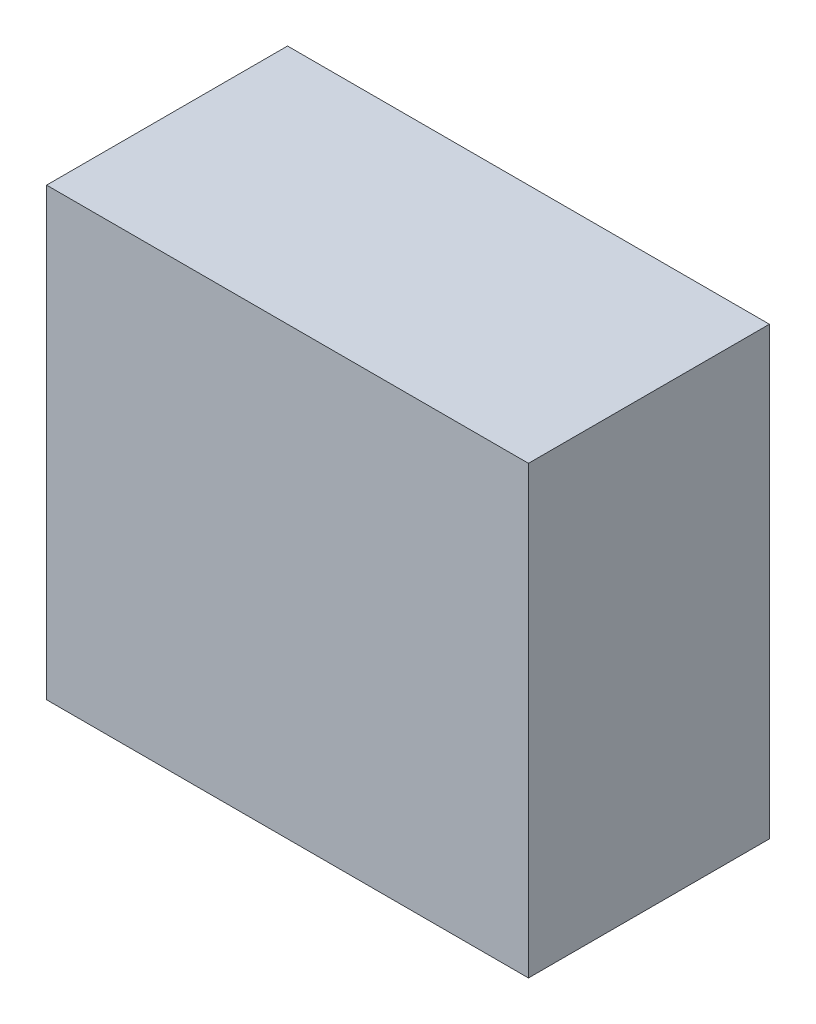
ISO-10303-21;
HEADER;
FILE_DESCRIPTION(('STEP AP214'),'2;1');
FILE_NAME('part.step','',(''),(''),'','','');
FILE_SCHEMA(('AUTOMOTIVE_DESIGN { 1 0 10303 214 1 1 1 1 }'));
ENDSEC;
DATA;
#1=APPLICATION_CONTEXT('core data for automotive mechanical design processes');
#2=APPLICATION_PROTOCOL_DEFINITION('international standard','automotive_design',2000,#1);
#3=PRODUCT_CONTEXT('',#1,'mechanical');
#4=PRODUCT('Part','Part','',(#3));
#5=PRODUCT_RELATED_PRODUCT_CATEGORY('part','',(#4));
#6=PRODUCT_DEFINITION_FORMATION('','',#4);
#7=PRODUCT_DEFINITION_CONTEXT('part definition',#1,'design');
#8=PRODUCT_DEFINITION('design','',#6,#7);
#9=PRODUCT_DEFINITION_SHAPE('','',#8);
#10=(LENGTH_UNIT() NAMED_UNIT(*) SI_UNIT(.MILLI.,.METRE.));
#11=(NAMED_UNIT(*) PLANE_ANGLE_UNIT() SI_UNIT($,.RADIAN.));
#12=(NAMED_UNIT(*) SI_UNIT($,.STERADIAN.) SOLID_ANGLE_UNIT());
#13=UNCERTAINTY_MEASURE_WITH_UNIT(LENGTH_MEASURE(1.E-05),#10,'distance_accuracy_value','');
#14=(GEOMETRIC_REPRESENTATION_CONTEXT(3) GLOBAL_UNCERTAINTY_ASSIGNED_CONTEXT((#13)) GLOBAL_UNIT_ASSIGNED_CONTEXT((#10,
#11,#12)) REPRESENTATION_CONTEXT('',''));
#15=CARTESIAN_POINT('',(0.,0.,0.));
#16=DIRECTION('',(0.,0.,1.));
#17=DIRECTION('',(1.,0.,0.));
#18=AXIS2_PLACEMENT_3D('',#15,#16,#17);
#19=CARTESIAN_POINT('',(0.,0.,10.));
#20=DIRECTION('',(1.,0.,0.));
#21=DIRECTION('',(0.,0.,-1.));
#22=AXIS2_PLACEMENT_3D('',#19,#20,#21);
#23=PLANE('',#22);
#24=DIRECTION('',(0.,-1.,0.));
#25=VECTOR('',#24,1.);
#26=CARTESIAN_POINT('',(0.,0.,0.));
#27=LINE('',#26,#25);
#28=CARTESIAN_POINT('',(0.,18.5,0.));
#29=VERTEX_POINT('',#28);
#30=CARTESIAN_POINT('',(0.,0.,0.));
#31=VERTEX_POINT('',#30);
#32=EDGE_CURVE('E102',#29,#31,#27,.T.);
#33=ORIENTED_EDGE('',*,*,#32,.T.);
#34=DIRECTION('',(0.,0.,-1.));
#35=VECTOR('',#34,1.);
#36=CARTESIAN_POINT('',(0.,0.,10.));
#37=LINE('',#36,#35);
#38=CARTESIAN_POINT('',(0.,0.,10.));
#39=VERTEX_POINT('',#38);
#40=EDGE_CURVE('E11',#39,#31,#37,.T.);
#41=ORIENTED_EDGE('',*,*,#40,.F.);
#42=DIRECTION('',(0.,-1.,0.));
#43=VECTOR('',#42,1.);
#44=CARTESIAN_POINT('',(0.,0.,10.));
#45=LINE('',#44,#43);
#46=CARTESIAN_POINT('',(0.,18.5,10.));
#47=VERTEX_POINT('',#46);
#48=EDGE_CURVE('E90',#47,#39,#45,.T.);
#49=ORIENTED_EDGE('',*,*,#48,.F.);
#50=DIRECTION('',(0.,0.,-1.));
#51=VECTOR('',#50,1.);
#52=CARTESIAN_POINT('',(0.,18.5,10.));
#53=LINE('',#52,#51);
#54=EDGE_CURVE('E98',#47,#29,#53,.T.);
#55=ORIENTED_EDGE('',*,*,#54,.T.);
#56=EDGE_LOOP('',(#33,#41,#49,#55));
#57=FACE_BOUND('',#56,.T.);
#58=ADVANCED_FACE('F39',(#57),#23,.F.);
#59=CARTESIAN_POINT('',(0.,0.,10.));
#60=DIRECTION('',(0.,1.,0.));
#61=DIRECTION('',(0.,0.,1.));
#62=AXIS2_PLACEMENT_3D('',#59,#60,#61);
#63=PLANE('',#62);
#64=DIRECTION('',(1.,0.,0.));
#65=VECTOR('',#64,1.);
#66=CARTESIAN_POINT('',(0.,0.,0.));
#67=LINE('',#66,#65);
#68=CARTESIAN_POINT('',(20.,0.,0.));
#69=VERTEX_POINT('',#68);
#70=EDGE_CURVE('E94',#31,#69,#67,.T.);
#71=ORIENTED_EDGE('',*,*,#70,.T.);
#72=DIRECTION('',(0.,0.,-1.));
#73=VECTOR('',#72,1.);
#74=CARTESIAN_POINT('',(20.,0.,10.));
#75=LINE('',#74,#73);
#76=CARTESIAN_POINT('',(20.,0.,10.));
#77=VERTEX_POINT('',#76);
#78=EDGE_CURVE('E47',#77,#69,#75,.T.);
#79=ORIENTED_EDGE('',*,*,#78,.F.);
#80=DIRECTION('',(1.,0.,0.));
#81=VECTOR('',#80,1.);
#82=CARTESIAN_POINT('',(0.,0.,10.));
#83=LINE('',#82,#81);
#84=EDGE_CURVE('E85',#39,#77,#83,.T.);
#85=ORIENTED_EDGE('',*,*,#84,.F.);
#86=ORIENTED_EDGE('',*,*,#40,.T.);
#87=EDGE_LOOP('',(#71,#79,#85,#86));
#88=FACE_BOUND('',#87,.T.);
#89=ADVANCED_FACE('F93',(#88),#63,.F.);
#90=CARTESIAN_POINT('',(20.,0.,10.));
#91=DIRECTION('',(-1.,0.,0.));
#92=DIRECTION('',(0.,0.,1.));
#93=AXIS2_PLACEMENT_3D('',#90,#91,#92);
#94=PLANE('',#93);
#95=DIRECTION('',(0.,1.,0.));
#96=VECTOR('',#95,1.);
#97=CARTESIAN_POINT('',(20.,0.,0.));
#98=LINE('',#97,#96);
#99=CARTESIAN_POINT('',(20.,18.5,0.));
#100=VERTEX_POINT('',#99);
#101=EDGE_CURVE('E72',#69,#100,#98,.T.);
#102=ORIENTED_EDGE('',*,*,#101,.T.);
#103=DIRECTION('',(0.,0.,-1.));
#104=VECTOR('',#103,1.);
#105=CARTESIAN_POINT('',(20.,18.5,10.));
#106=LINE('',#105,#104);
#107=CARTESIAN_POINT('',(20.,18.5,10.));
#108=VERTEX_POINT('',#107);
#109=EDGE_CURVE('E95',#108,#100,#106,.T.);
#110=ORIENTED_EDGE('',*,*,#109,.F.);
#111=DIRECTION('',(0.,1.,0.));
#112=VECTOR('',#111,1.);
#113=CARTESIAN_POINT('',(20.,0.,10.));
#114=LINE('',#113,#112);
#115=EDGE_CURVE('E88',#77,#108,#114,.T.);
#116=ORIENTED_EDGE('',*,*,#115,.F.);
#117=ORIENTED_EDGE('',*,*,#78,.T.);
#118=EDGE_LOOP('',(#102,#110,#116,#117));
#119=FACE_BOUND('',#118,.T.);
#120=ADVANCED_FACE('F96',(#119),#94,.F.);
#121=CARTESIAN_POINT('',(0.,18.5,10.));
#122=DIRECTION('',(0.,-1.,0.));
#123=DIRECTION('',(0.,0.,-1.));
#124=AXIS2_PLACEMENT_3D('',#121,#122,#123);
#125=PLANE('',#124);
#126=DIRECTION('',(-1.,0.,0.));
#127=VECTOR('',#126,1.);
#128=CARTESIAN_POINT('',(0.,18.5,0.));
#129=LINE('',#128,#127);
#130=EDGE_CURVE('E78',#100,#29,#129,.T.);
#131=ORIENTED_EDGE('',*,*,#130,.T.);
#132=ORIENTED_EDGE('',*,*,#54,.F.);
#133=DIRECTION('',(-1.,0.,0.));
#134=VECTOR('',#133,1.);
#135=CARTESIAN_POINT('',(0.,18.5,10.));
#136=LINE('',#135,#134);
#137=EDGE_CURVE('E55',#108,#47,#136,.T.);
#138=ORIENTED_EDGE('',*,*,#137,.F.);
#139=ORIENTED_EDGE('',*,*,#109,.T.);
#140=EDGE_LOOP('',(#131,#132,#138,#139));
#141=FACE_BOUND('',#140,.T.);
#142=ADVANCED_FACE('F109',(#141),#125,.F.);
#143=CARTESIAN_POINT('',(0.,0.,10.));
#144=DIRECTION('',(0.,0.,-1.));
#145=DIRECTION('',(-1.,0.,0.));
#146=AXIS2_PLACEMENT_3D('',#143,#144,#145);
#147=PLANE('',#146);
#148=ORIENTED_EDGE('',*,*,#48,.T.);
#149=ORIENTED_EDGE('',*,*,#84,.T.);
#150=ORIENTED_EDGE('',*,*,#115,.T.);
#151=ORIENTED_EDGE('',*,*,#137,.T.);
#152=EDGE_LOOP('',(#148,#149,#150,#151));
#153=FACE_BOUND('',#152,.T.);
#154=ADVANCED_FACE('F86',(#153),#147,.F.);
#155=CARTESIAN_POINT('',(0.,0.,0.));
#156=DIRECTION('',(0.,0.,-1.));
#157=DIRECTION('',(-1.,0.,0.));
#158=AXIS2_PLACEMENT_3D('',#155,#156,#157);
#159=PLANE('',#158);
#160=ORIENTED_EDGE('',*,*,#32,.F.);
#161=ORIENTED_EDGE('',*,*,#130,.F.);
#162=ORIENTED_EDGE('',*,*,#101,.F.);
#163=ORIENTED_EDGE('',*,*,#70,.F.);
#164=EDGE_LOOP('',(#160,#161,#162,#163));
#165=FACE_BOUND('',#164,.T.);
#166=ADVANCED_FACE('F112',(#165),#159,.T.);
#167=CLOSED_SHELL('',(#58,#89,#120,#142,#154,#166));
#168=MANIFOLD_SOLID_BREP('B2',#167);
#169=ADVANCED_BREP_SHAPE_REPRESENTATION('',(#18,#168),#14);
#170=SHAPE_DEFINITION_REPRESENTATION(#9,#169);
ENDSEC;
END-ISO-10303-21;
